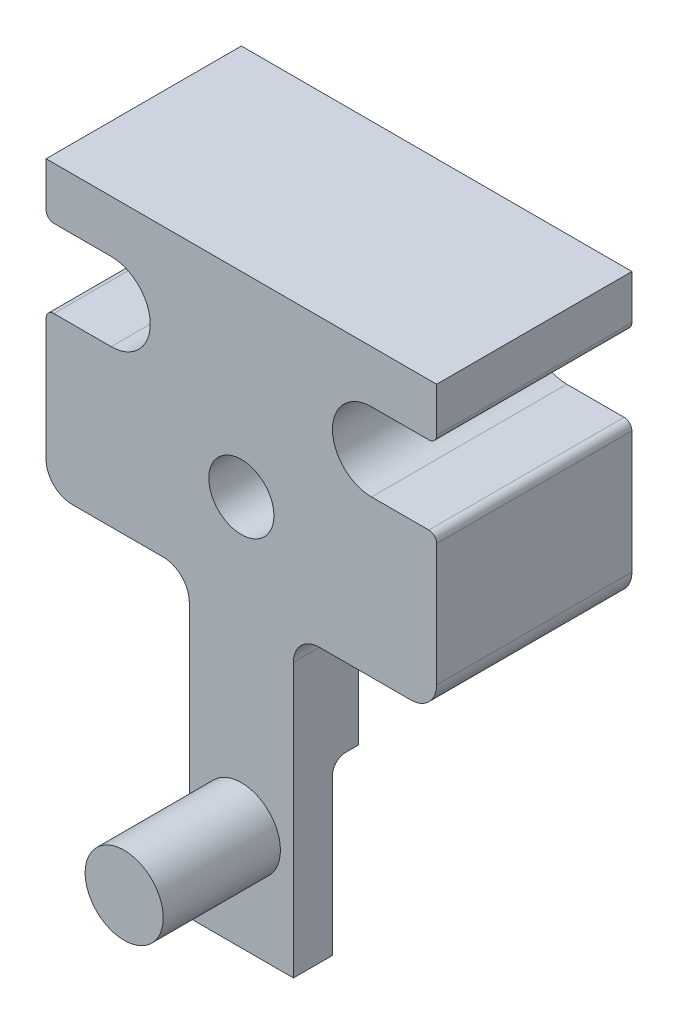
ISO-10303-21;
HEADER;
FILE_DESCRIPTION(('STEP AP214'),'2;1');
FILE_NAME('part.step','',(''),(''),'','','');
FILE_SCHEMA(('AUTOMOTIVE_DESIGN { 1 0 10303 214 1 1 1 1 }'));
ENDSEC;
DATA;
#1=APPLICATION_CONTEXT('core data for automotive mechanical design processes');
#2=APPLICATION_PROTOCOL_DEFINITION('international standard','automotive_design',2000,#1);
#3=PRODUCT_CONTEXT('',#1,'mechanical');
#4=PRODUCT('Part','Part','',(#3));
#5=PRODUCT_RELATED_PRODUCT_CATEGORY('part','',(#4));
#6=PRODUCT_DEFINITION_FORMATION('','',#4);
#7=PRODUCT_DEFINITION_CONTEXT('part definition',#1,'design');
#8=PRODUCT_DEFINITION('design','',#6,#7);
#9=PRODUCT_DEFINITION_SHAPE('','',#8);
#10=(LENGTH_UNIT() NAMED_UNIT(*) SI_UNIT(.MILLI.,.METRE.));
#11=(NAMED_UNIT(*) PLANE_ANGLE_UNIT() SI_UNIT($,.RADIAN.));
#12=(NAMED_UNIT(*) SI_UNIT($,.STERADIAN.) SOLID_ANGLE_UNIT());
#13=UNCERTAINTY_MEASURE_WITH_UNIT(LENGTH_MEASURE(1.E-05),#10,'distance_accuracy_value','');
#14=(GEOMETRIC_REPRESENTATION_CONTEXT(3) GLOBAL_UNCERTAINTY_ASSIGNED_CONTEXT((#13)) GLOBAL_UNIT_ASSIGNED_CONTEXT((#10,
#11,#12)) REPRESENTATION_CONTEXT('',''));
#15=CARTESIAN_POINT('',(0.,0.,0.));
#16=DIRECTION('',(0.,0.,1.));
#17=DIRECTION('',(1.,0.,0.));
#18=AXIS2_PLACEMENT_3D('',#15,#16,#17);
#19=CARTESIAN_POINT('',(0.,-5.5,7.5));
#20=DIRECTION('',(0.,1.,0.));
#21=DIRECTION('',(0.,0.,1.));
#22=AXIS2_PLACEMENT_3D('',#19,#20,#21);
#23=PLANE('',#22);
#24=DIRECTION('',(1.,0.,0.));
#25=VECTOR('',#24,1.);
#26=CARTESIAN_POINT('',(0.,-5.5,7.5));
#27=LINE('',#26,#25);
#28=CARTESIAN_POINT('',(3.,-5.5,7.5));
#29=VERTEX_POINT('',#28);
#30=CARTESIAN_POINT('',(6.50000000000001,-5.5,7.5));
#31=VERTEX_POINT('',#30);
#32=EDGE_CURVE('E355',#29,#31,#27,.T.);
#33=ORIENTED_EDGE('',*,*,#32,.F.);
#34=DIRECTION('',(0.,0.,1.));
#35=VECTOR('',#34,1.);
#36=CARTESIAN_POINT('',(3.,-5.5,7.5));
#37=LINE('',#36,#35);
#38=CARTESIAN_POINT('',(3.,-5.5,5.));
#39=VERTEX_POINT('',#38);
#40=EDGE_CURVE('E471',#29,#39,#37,.F.);
#41=ORIENTED_EDGE('',*,*,#40,.T.);
#42=DIRECTION('',(-1.,0.,0.));
#43=VECTOR('',#42,1.);
#44=CARTESIAN_POINT('',(-2.,-5.5,5.));
#45=LINE('',#44,#43);
#46=CARTESIAN_POINT('',(1.,-5.5,5.));
#47=VERTEX_POINT('',#46);
#48=EDGE_CURVE('E254',#39,#47,#45,.T.);
#49=ORIENTED_EDGE('',*,*,#48,.T.);
#50=DIRECTION('',(0.,0.,-1.));
#51=VECTOR('',#50,1.);
#52=CARTESIAN_POINT('',(1.,-5.5,3.5));
#53=LINE('',#52,#51);
#54=CARTESIAN_POINT('',(1.,-5.5,3.0857864376269));
#55=VERTEX_POINT('',#54);
#56=EDGE_CURVE('E278',#47,#55,#53,.T.);
#57=ORIENTED_EDGE('',*,*,#56,.T.);
#58=DIRECTION('',(-1.,0.,0.));
#59=VECTOR('',#58,1.);
#60=CARTESIAN_POINT('',(0.,-5.5,3.0857864376269));
#61=LINE('',#60,#59);
#62=CARTESIAN_POINT('',(-1.,-5.5,3.0857864376269));
#63=VERTEX_POINT('',#62);
#64=EDGE_CURVE('E261',#55,#63,#61,.T.);
#65=ORIENTED_EDGE('',*,*,#64,.T.);
#66=DIRECTION('',(0.,0.,-1.));
#67=VECTOR('',#66,1.);
#68=CARTESIAN_POINT('',(-1.,-5.5,3.5));
#69=LINE('',#68,#67);
#70=CARTESIAN_POINT('',(-1.,-5.5,5.));
#71=VERTEX_POINT('',#70);
#72=EDGE_CURVE('E258',#71,#63,#69,.T.);
#73=ORIENTED_EDGE('',*,*,#72,.F.);
#74=CARTESIAN_POINT('',(-3.,-5.5,5.));
#75=VERTEX_POINT('',#74);
#76=EDGE_CURVE('E245',#71,#75,#45,.T.);
#77=ORIENTED_EDGE('',*,*,#76,.T.);
#78=DIRECTION('',(0.,0.,1.));
#79=VECTOR('',#78,1.);
#80=CARTESIAN_POINT('',(-3.,-5.5,7.5));
#81=LINE('',#80,#79);
#82=CARTESIAN_POINT('',(-3.,-5.5,7.5));
#83=VERTEX_POINT('',#82);
#84=EDGE_CURVE('E469',#75,#83,#81,.T.);
#85=ORIENTED_EDGE('',*,*,#84,.T.);
#86=CARTESIAN_POINT('',(-6.49999999999999,-5.5,7.5));
#87=VERTEX_POINT('',#86);
#88=EDGE_CURVE('E352',#87,#83,#27,.T.);
#89=ORIENTED_EDGE('',*,*,#88,.F.);
#90=DIRECTION('',(0.,0.,-1.));
#91=VECTOR('',#90,1.);
#92=CARTESIAN_POINT('',(-6.49999999999999,-5.5,0.));
#93=LINE('',#92,#91);
#94=CARTESIAN_POINT('',(-6.49999999999999,-5.5,0.));
#95=VERTEX_POINT('',#94);
#96=EDGE_CURVE('E444',#87,#95,#93,.T.);
#97=ORIENTED_EDGE('',*,*,#96,.T.);
#98=DIRECTION('',(1.,0.,0.));
#99=VECTOR('',#98,1.);
#100=CARTESIAN_POINT('',(0.,-5.5,0.));
#101=LINE('',#100,#99);
#102=CARTESIAN_POINT('',(6.50000000000001,-5.5,0.));
#103=VERTEX_POINT('',#102);
#104=EDGE_CURVE('E379',#95,#103,#101,.T.);
#105=ORIENTED_EDGE('',*,*,#104,.T.);
#106=DIRECTION('',(0.,0.,-1.));
#107=VECTOR('',#106,1.);
#108=CARTESIAN_POINT('',(6.50000000000001,-5.5,7.5));
#109=LINE('',#108,#107);
#110=EDGE_CURVE('E447',#103,#31,#109,.F.);
#111=ORIENTED_EDGE('',*,*,#110,.T.);
#112=EDGE_LOOP('',(#33,#41,#49,#57,#65,#73,#77,#85,#89,#97,#105,#111));
#113=FACE_BOUND('',#112,.T.);
#114=ADVANCED_FACE('F39',(#113),#23,.F.);
#115=CARTESIAN_POINT('',(0.,0.,5.));
#116=DIRECTION('',(0.,0.,-1.));
#117=DIRECTION('',(-1.,0.,0.));
#118=AXIS2_PLACEMENT_3D('',#115,#116,#117);
#119=PLANE('',#118);
#120=DIRECTION('',(0.,1.,0.));
#121=VECTOR('',#120,1.);
#122=CARTESIAN_POINT('',(-1.,-5.5,5.));
#123=LINE('',#122,#121);
#124=CARTESIAN_POINT('',(-1.,-7.4142135623731,5.));
#125=VERTEX_POINT('',#124);
#126=EDGE_CURVE('E54',#125,#71,#123,.T.);
#127=ORIENTED_EDGE('',*,*,#126,.F.);
#128=DIRECTION('',(-1.,0.,0.));
#129=VECTOR('',#128,1.);
#130=CARTESIAN_POINT('',(1.,-7.4142135623731,5.));
#131=LINE('',#130,#129);
#132=CARTESIAN_POINT('',(1.,-7.4142135623731,5.));
#133=VERTEX_POINT('',#132);
#134=EDGE_CURVE('E481',#125,#133,#131,.F.);
#135=ORIENTED_EDGE('',*,*,#134,.T.);
#136=DIRECTION('',(0.,1.,0.));
#137=VECTOR('',#136,1.);
#138=CARTESIAN_POINT('',(1.,-5.5,5.));
#139=LINE('',#138,#137);
#140=EDGE_CURVE('E61',#133,#47,#139,.T.);
#141=ORIENTED_EDGE('',*,*,#140,.T.);
#142=ORIENTED_EDGE('',*,*,#48,.F.);
#143=CARTESIAN_POINT('',(3.,-6.5,5.));
#144=DIRECTION('',(0.,0.,-1.));
#145=DIRECTION('',(-1.,0.,0.));
#146=AXIS2_PLACEMENT_3D('',#143,#144,#145);
#147=CIRCLE('',#146,1.);
#148=CARTESIAN_POINT('',(2.,-6.5,5.));
#149=VERTEX_POINT('',#148);
#150=EDGE_CURVE('E485',#39,#149,#147,.F.);
#151=ORIENTED_EDGE('',*,*,#150,.T.);
#152=DIRECTION('',(0.,1.,0.));
#153=VECTOR('',#152,1.);
#154=CARTESIAN_POINT('',(2.,-5.5,5.));
#155=LINE('',#154,#153);
#156=CARTESIAN_POINT('',(2.,-10.5,5.));
#157=VERTEX_POINT('',#156);
#158=EDGE_CURVE('E307',#157,#149,#155,.T.);
#159=ORIENTED_EDGE('',*,*,#158,.F.);
#160=DIRECTION('',(1.,0.,0.));
#161=VECTOR('',#160,1.);
#162=CARTESIAN_POINT('',(-2.,-10.5,5.));
#163=LINE('',#162,#161);
#164=CARTESIAN_POINT('',(-2.,-10.5,5.));
#165=VERTEX_POINT('',#164);
#166=EDGE_CURVE('E304',#165,#157,#163,.T.);
#167=ORIENTED_EDGE('',*,*,#166,.F.);
#168=DIRECTION('',(0.,-1.,0.));
#169=VECTOR('',#168,1.);
#170=CARTESIAN_POINT('',(-2.,-5.5,5.));
#171=LINE('',#170,#169);
#172=CARTESIAN_POINT('',(-2.,-6.5,5.));
#173=VERTEX_POINT('',#172);
#174=EDGE_CURVE('E302',#173,#165,#171,.T.);
#175=ORIENTED_EDGE('',*,*,#174,.F.);
#176=CARTESIAN_POINT('',(-3.,-6.5,5.));
#177=DIRECTION('',(0.,0.,-1.));
#178=DIRECTION('',(-1.,0.,0.));
#179=AXIS2_PLACEMENT_3D('',#176,#177,#178);
#180=CIRCLE('',#179,1.);
#181=EDGE_CURVE('E250',#173,#75,#180,.F.);
#182=ORIENTED_EDGE('',*,*,#181,.T.);
#183=ORIENTED_EDGE('',*,*,#76,.F.);
#184=EDGE_LOOP('',(#127,#135,#141,#142,#151,#159,#167,#175,#182,#183));
#185=FACE_BOUND('',#184,.T.);
#186=ADVANCED_FACE('F247',(#185),#119,.T.);
#187=CARTESIAN_POINT('',(-2.,-10.5,5.));
#188=DIRECTION('',(0.,-1.,0.));
#189=DIRECTION('',(0.,0.,-1.));
#190=AXIS2_PLACEMENT_3D('',#187,#188,#189);
#191=PLANE('',#190);
#192=DIRECTION('',(0.,0.,1.));
#193=VECTOR('',#192,1.);
#194=CARTESIAN_POINT('',(2.,-10.5,5.));
#195=LINE('',#194,#193);
#196=CARTESIAN_POINT('',(2.,-10.5,5.5));
#197=VERTEX_POINT('',#196);
#198=EDGE_CURVE('E314',#157,#197,#195,.T.);
#199=ORIENTED_EDGE('',*,*,#198,.T.);
#200=DIRECTION('',(-1.,0.,0.));
#201=VECTOR('',#200,1.);
#202=CARTESIAN_POINT('',(-2.,-10.5,5.5));
#203=LINE('',#202,#201);
#204=CARTESIAN_POINT('',(-2.,-10.5,5.5));
#205=VERTEX_POINT('',#204);
#206=EDGE_CURVE('E456',#197,#205,#203,.T.);
#207=ORIENTED_EDGE('',*,*,#206,.T.);
#208=DIRECTION('',(0.,0.,1.));
#209=VECTOR('',#208,1.);
#210=CARTESIAN_POINT('',(-2.,-10.5,5.));
#211=LINE('',#210,#209);
#212=EDGE_CURVE('E310',#165,#205,#211,.T.);
#213=ORIENTED_EDGE('',*,*,#212,.F.);
#214=ORIENTED_EDGE('',*,*,#166,.T.);
#215=EDGE_LOOP('',(#199,#207,#213,#214));
#216=FACE_BOUND('',#215,.T.);
#217=ADVANCED_FACE('F519',(#216),#191,.T.);
#218=CARTESIAN_POINT('',(0.,0.5,7.5));
#219=DIRECTION('',(0.,1.,0.));
#220=DIRECTION('',(-1.,0.,0.));
#221=AXIS2_PLACEMENT_3D('',#218,#219,#220);
#222=PLANE('',#221);
#223=DIRECTION('',(1.,0.,0.));
#224=VECTOR('',#223,1.);
#225=CARTESIAN_POINT('',(0.,0.5,7.5));
#226=LINE('',#225,#224);
#227=CARTESIAN_POINT('',(4.99999999999999,0.499999999999998,7.5));
#228=VERTEX_POINT('',#227);
#229=CARTESIAN_POINT('',(7.20000000000001,0.499999999999998,7.5));
#230=VERTEX_POINT('',#229);
#231=EDGE_CURVE('E326',#228,#230,#226,.T.);
#232=ORIENTED_EDGE('',*,*,#231,.T.);
#233=DIRECTION('',(0.,0.,-1.));
#234=VECTOR('',#233,1.);
#235=CARTESIAN_POINT('',(7.20000000000001,0.499999999999998,0.));
#236=LINE('',#235,#234);
#237=CARTESIAN_POINT('',(7.20000000000001,0.499999999999998,0.));
#238=VERTEX_POINT('',#237);
#239=EDGE_CURVE('E398',#230,#238,#236,.T.);
#240=ORIENTED_EDGE('',*,*,#239,.T.);
#241=DIRECTION('',(1.,0.,0.));
#242=VECTOR('',#241,1.);
#243=CARTESIAN_POINT('',(0.,0.5,0.));
#244=LINE('',#243,#242);
#245=CARTESIAN_POINT('',(4.99999999999999,0.499999999999998,0.));
#246=VERTEX_POINT('',#245);
#247=EDGE_CURVE('E325',#246,#238,#244,.T.);
#248=ORIENTED_EDGE('',*,*,#247,.F.);
#249=DIRECTION('',(0.,0.,-1.));
#250=VECTOR('',#249,1.);
#251=CARTESIAN_POINT('',(4.99999999999999,0.499999999999998,7.5));
#252=LINE('',#251,#250);
#253=EDGE_CURVE('E396',#228,#246,#252,.T.);
#254=ORIENTED_EDGE('',*,*,#253,.F.);
#255=EDGE_LOOP('',(#232,#240,#248,#254));
#256=FACE_BOUND('',#255,.T.);
#257=ADVANCED_FACE('F606',(#256),#222,.T.);
#258=CARTESIAN_POINT('',(4.99999999999999,2.,7.5));
#259=DIRECTION('',(0.,0.,-1.));
#260=DIRECTION('',(-1.,0.,0.));
#261=AXIS2_PLACEMENT_3D('',#258,#259,#260);
#262=CYLINDRICAL_SURFACE('',#261,1.5);
#263=CARTESIAN_POINT('',(4.99999999999999,2.,0.));
#264=DIRECTION('',(0.,0.,1.));
#265=DIRECTION('',(1.,0.,0.));
#266=AXIS2_PLACEMENT_3D('',#263,#264,#265);
#267=CIRCLE('',#266,1.5);
#268=CARTESIAN_POINT('',(4.99999999999999,3.5,0.));
#269=VERTEX_POINT('',#268);
#270=EDGE_CURVE('E358',#246,#269,#267,.F.);
#271=ORIENTED_EDGE('',*,*,#270,.T.);
#272=DIRECTION('',(0.,0.,-1.));
#273=VECTOR('',#272,1.);
#274=CARTESIAN_POINT('',(4.99999999999999,3.5,7.5));
#275=LINE('',#274,#273);
#276=CARTESIAN_POINT('',(4.99999999999999,3.5,7.5));
#277=VERTEX_POINT('',#276);
#278=EDGE_CURVE('E393',#277,#269,#275,.T.);
#279=ORIENTED_EDGE('',*,*,#278,.F.);
#280=CARTESIAN_POINT('',(4.99999999999999,2.,7.5));
#281=DIRECTION('',(0.,0.,1.));
#282=DIRECTION('',(1.,0.,0.));
#283=AXIS2_PLACEMENT_3D('',#280,#281,#282);
#284=CIRCLE('',#283,1.5);
#285=EDGE_CURVE('E329',#228,#277,#284,.F.);
#286=ORIENTED_EDGE('',*,*,#285,.F.);
#287=ORIENTED_EDGE('',*,*,#253,.T.);
#288=EDGE_LOOP('',(#271,#279,#286,#287));
#289=FACE_BOUND('',#288,.T.);
#290=ADVANCED_FACE('F602',(#289),#262,.F.);
#291=CARTESIAN_POINT('',(0.,3.5,7.5));
#292=DIRECTION('',(0.,-1.,0.));
#293=DIRECTION('',(0.,0.,-1.));
#294=AXIS2_PLACEMENT_3D('',#291,#292,#293);
#295=PLANE('',#294);
#296=DIRECTION('',(-1.,0.,0.));
#297=VECTOR('',#296,1.);
#298=CARTESIAN_POINT('',(0.,3.5,0.));
#299=LINE('',#298,#297);
#300=CARTESIAN_POINT('',(7.20000000000001,3.5,0.));
#301=VERTEX_POINT('',#300);
#302=EDGE_CURVE('E361',#301,#269,#299,.T.);
#303=ORIENTED_EDGE('',*,*,#302,.F.);
#304=DIRECTION('',(0.,0.,-1.));
#305=VECTOR('',#304,1.);
#306=CARTESIAN_POINT('',(7.20000000000001,3.5,7.5));
#307=LINE('',#306,#305);
#308=CARTESIAN_POINT('',(7.20000000000001,3.5,7.5));
#309=VERTEX_POINT('',#308);
#310=EDGE_CURVE('E425',#301,#309,#307,.F.);
#311=ORIENTED_EDGE('',*,*,#310,.T.);
#312=DIRECTION('',(-1.,0.,0.));
#313=VECTOR('',#312,1.);
#314=CARTESIAN_POINT('',(0.,3.5,7.5));
#315=LINE('',#314,#313);
#316=EDGE_CURVE('E333',#309,#277,#315,.T.);
#317=ORIENTED_EDGE('',*,*,#316,.T.);
#318=ORIENTED_EDGE('',*,*,#278,.T.);
#319=EDGE_LOOP('',(#303,#311,#317,#318));
#320=FACE_BOUND('',#319,.T.);
#321=ADVANCED_FACE('F598',(#320),#295,.T.);
#322=CARTESIAN_POINT('',(7.50000000000001,0.,7.5));
#323=DIRECTION('',(-1.,0.,0.));
#324=DIRECTION('',(0.,0.,1.));
#325=AXIS2_PLACEMENT_3D('',#322,#323,#324);
#326=PLANE('',#325);
#327=DIRECTION('',(0.,1.,0.));
#328=VECTOR('',#327,1.);
#329=CARTESIAN_POINT('',(7.50000000000001,0.,7.5));
#330=LINE('',#329,#328);
#331=CARTESIAN_POINT('',(7.50000000000001,3.8,7.5));
#332=VERTEX_POINT('',#331);
#333=CARTESIAN_POINT('',(7.50000000000001,5.49999999999999,7.5));
#334=VERTEX_POINT('',#333);
#335=EDGE_CURVE('E335',#332,#334,#330,.T.);
#336=ORIENTED_EDGE('',*,*,#335,.F.);
#337=DIRECTION('',(0.,0.,-1.));
#338=VECTOR('',#337,1.);
#339=CARTESIAN_POINT('',(7.50000000000001,3.8,0.));
#340=LINE('',#339,#338);
#341=CARTESIAN_POINT('',(7.50000000000001,3.8,0.));
#342=VERTEX_POINT('',#341);
#343=EDGE_CURVE('E422',#332,#342,#340,.T.);
#344=ORIENTED_EDGE('',*,*,#343,.T.);
#345=DIRECTION('',(0.,1.,0.));
#346=VECTOR('',#345,1.);
#347=CARTESIAN_POINT('',(7.50000000000001,0.,0.));
#348=LINE('',#347,#346);
#349=CARTESIAN_POINT('',(7.50000000000001,5.49999999999999,0.));
#350=VERTEX_POINT('',#349);
#351=EDGE_CURVE('E363',#342,#350,#348,.T.);
#352=ORIENTED_EDGE('',*,*,#351,.T.);
#353=DIRECTION('',(0.,0.,-1.));
#354=VECTOR('',#353,1.);
#355=CARTESIAN_POINT('',(7.50000000000001,5.49999999999999,7.5));
#356=LINE('',#355,#354);
#357=EDGE_CURVE('E390',#334,#350,#356,.T.);
#358=ORIENTED_EDGE('',*,*,#357,.F.);
#359=EDGE_LOOP('',(#336,#344,#352,#358));
#360=FACE_BOUND('',#359,.T.);
#361=ADVANCED_FACE('F590',(#360),#326,.F.);
#362=CARTESIAN_POINT('',(0.,5.49999999999999,7.5));
#363=DIRECTION('',(0.,1.,0.));
#364=DIRECTION('',(0.,0.,1.));
#365=AXIS2_PLACEMENT_3D('',#362,#363,#364);
#366=PLANE('',#365);
#367=DIRECTION('',(1.,0.,0.));
#368=VECTOR('',#367,1.);
#369=CARTESIAN_POINT('',(0.,5.49999999999999,0.));
#370=LINE('',#369,#368);
#371=CARTESIAN_POINT('',(-7.49999999999999,5.49999999999999,0.));
#372=VERTEX_POINT('',#371);
#373=EDGE_CURVE('E365',#372,#350,#370,.T.);
#374=ORIENTED_EDGE('',*,*,#373,.F.);
#375=DIRECTION('',(0.,0.,-1.));
#376=VECTOR('',#375,1.);
#377=CARTESIAN_POINT('',(-7.49999999999999,5.49999999999999,7.5));
#378=LINE('',#377,#376);
#379=CARTESIAN_POINT('',(-7.49999999999999,5.49999999999999,7.5));
#380=VERTEX_POINT('',#379);
#381=EDGE_CURVE('E387',#380,#372,#378,.T.);
#382=ORIENTED_EDGE('',*,*,#381,.F.);
#383=DIRECTION('',(1.,0.,0.));
#384=VECTOR('',#383,1.);
#385=CARTESIAN_POINT('',(0.,5.49999999999999,7.5));
#386=LINE('',#385,#384);
#387=EDGE_CURVE('E337',#380,#334,#386,.T.);
#388=ORIENTED_EDGE('',*,*,#387,.T.);
#389=ORIENTED_EDGE('',*,*,#357,.T.);
#390=EDGE_LOOP('',(#374,#382,#388,#389));
#391=FACE_BOUND('',#390,.T.);
#392=ADVANCED_FACE('F586',(#391),#366,.T.);
#393=CARTESIAN_POINT('',(-7.49999999999999,0.,7.5));
#394=DIRECTION('',(-1.,0.,0.));
#395=DIRECTION('',(0.,0.,1.));
#396=AXIS2_PLACEMENT_3D('',#393,#394,#395);
#397=PLANE('',#396);
#398=DIRECTION('',(0.,1.,0.));
#399=VECTOR('',#398,1.);
#400=CARTESIAN_POINT('',(-7.49999999999999,0.,0.));
#401=LINE('',#400,#399);
#402=CARTESIAN_POINT('',(-7.49999999999999,3.8,0.));
#403=VERTEX_POINT('',#402);
#404=EDGE_CURVE('E368',#403,#372,#401,.T.);
#405=ORIENTED_EDGE('',*,*,#404,.F.);
#406=DIRECTION('',(0.,0.,-1.));
#407=VECTOR('',#406,1.);
#408=CARTESIAN_POINT('',(-7.49999999999999,3.8,7.5));
#409=LINE('',#408,#407);
#410=CARTESIAN_POINT('',(-7.49999999999999,3.8,7.5));
#411=VERTEX_POINT('',#410);
#412=EDGE_CURVE('E435',#403,#411,#409,.F.);
#413=ORIENTED_EDGE('',*,*,#412,.T.);
#414=DIRECTION('',(0.,1.,0.));
#415=VECTOR('',#414,1.);
#416=CARTESIAN_POINT('',(-7.49999999999999,0.,7.5));
#417=LINE('',#416,#415);
#418=EDGE_CURVE('E341',#411,#380,#417,.T.);
#419=ORIENTED_EDGE('',*,*,#418,.T.);
#420=ORIENTED_EDGE('',*,*,#381,.T.);
#421=EDGE_LOOP('',(#405,#413,#419,#420));
#422=FACE_BOUND('',#421,.T.);
#423=ADVANCED_FACE('F579',(#422),#397,.T.);
#424=CARTESIAN_POINT('',(0.,3.5,7.5));
#425=DIRECTION('',(0.,1.,0.));
#426=DIRECTION('',(0.,0.,1.));
#427=AXIS2_PLACEMENT_3D('',#424,#425,#426);
#428=PLANE('',#427);
#429=DIRECTION('',(1.,0.,0.));
#430=VECTOR('',#429,1.);
#431=CARTESIAN_POINT('',(0.,3.5,7.5));
#432=LINE('',#431,#430);
#433=CARTESIAN_POINT('',(-7.19999999999999,3.5,7.5));
#434=VERTEX_POINT('',#433);
#435=CARTESIAN_POINT('',(-4.99999999999999,3.5,7.5));
#436=VERTEX_POINT('',#435);
#437=EDGE_CURVE('E343',#434,#436,#432,.T.);
#438=ORIENTED_EDGE('',*,*,#437,.F.);
#439=DIRECTION('',(0.,0.,-1.));
#440=VECTOR('',#439,1.);
#441=CARTESIAN_POINT('',(-7.19999999999999,3.5,0.));
#442=LINE('',#441,#440);
#443=CARTESIAN_POINT('',(-7.19999999999999,3.5,0.));
#444=VERTEX_POINT('',#443);
#445=EDGE_CURVE('E432',#434,#444,#442,.T.);
#446=ORIENTED_EDGE('',*,*,#445,.T.);
#447=DIRECTION('',(1.,0.,0.));
#448=VECTOR('',#447,1.);
#449=CARTESIAN_POINT('',(0.,3.5,0.));
#450=LINE('',#449,#448);
#451=CARTESIAN_POINT('',(-4.99999999999999,3.5,0.));
#452=VERTEX_POINT('',#451);
#453=EDGE_CURVE('E370',#444,#452,#450,.T.);
#454=ORIENTED_EDGE('',*,*,#453,.T.);
#455=DIRECTION('',(0.,0.,-1.));
#456=VECTOR('',#455,1.);
#457=CARTESIAN_POINT('',(-4.99999999999999,3.5,7.5));
#458=LINE('',#457,#456);
#459=EDGE_CURVE('E384',#436,#452,#458,.T.);
#460=ORIENTED_EDGE('',*,*,#459,.F.);
#461=EDGE_LOOP('',(#438,#446,#454,#460));
#462=FACE_BOUND('',#461,.T.);
#463=ADVANCED_FACE('F571',(#462),#428,.F.);
#464=CARTESIAN_POINT('',(-4.99999999999999,2.,7.5));
#465=DIRECTION('',(0.,0.,-1.));
#466=DIRECTION('',(-1.,0.,0.));
#467=AXIS2_PLACEMENT_3D('',#464,#465,#466);
#468=CYLINDRICAL_SURFACE('',#467,1.5);
#469=CARTESIAN_POINT('',(-4.99999999999999,2.,0.));
#470=DIRECTION('',(0.,0.,1.));
#471=DIRECTION('',(1.,0.,0.));
#472=AXIS2_PLACEMENT_3D('',#469,#470,#471);
#473=CIRCLE('',#472,1.5);
#474=CARTESIAN_POINT('',(-4.99999999999999,0.499999999999998,0.));
#475=VERTEX_POINT('',#474);
#476=EDGE_CURVE('E373',#475,#452,#473,.T.);
#477=ORIENTED_EDGE('',*,*,#476,.F.);
#478=DIRECTION('',(0.,0.,-1.));
#479=VECTOR('',#478,1.);
#480=CARTESIAN_POINT('',(-4.99999999999999,0.499999999999998,7.5));
#481=LINE('',#480,#479);
#482=CARTESIAN_POINT('',(-4.99999999999999,0.499999999999998,7.5));
#483=VERTEX_POINT('',#482);
#484=EDGE_CURVE('E382',#483,#475,#481,.T.);
#485=ORIENTED_EDGE('',*,*,#484,.F.);
#486=CARTESIAN_POINT('',(-4.99999999999999,2.,7.5));
#487=DIRECTION('',(0.,0.,1.));
#488=DIRECTION('',(1.,0.,0.));
#489=AXIS2_PLACEMENT_3D('',#486,#487,#488);
#490=CIRCLE('',#489,1.5);
#491=EDGE_CURVE('E346',#483,#436,#490,.T.);
#492=ORIENTED_EDGE('',*,*,#491,.T.);
#493=ORIENTED_EDGE('',*,*,#459,.T.);
#494=EDGE_LOOP('',(#477,#485,#492,#493));
#495=FACE_BOUND('',#494,.T.);
#496=ADVANCED_FACE('F565',(#495),#468,.F.);
#497=CARTESIAN_POINT('',(0.,0.5,7.5));
#498=DIRECTION('',(0.,-1.,0.));
#499=DIRECTION('',(1.,0.,0.));
#500=AXIS2_PLACEMENT_3D('',#497,#498,#499);
#501=PLANE('',#500);
#502=DIRECTION('',(-1.,0.,0.));
#503=VECTOR('',#502,1.);
#504=CARTESIAN_POINT('',(0.,0.5,0.));
#505=LINE('',#504,#503);
#506=CARTESIAN_POINT('',(-7.19999999999999,0.499999999999998,0.));
#507=VERTEX_POINT('',#506);
#508=EDGE_CURVE('E376',#475,#507,#505,.T.);
#509=ORIENTED_EDGE('',*,*,#508,.T.);
#510=DIRECTION('',(0.,0.,-1.));
#511=VECTOR('',#510,1.);
#512=CARTESIAN_POINT('',(-7.19999999999999,0.499999999999998,7.5));
#513=LINE('',#512,#511);
#514=CARTESIAN_POINT('',(-7.19999999999999,0.499999999999998,7.5));
#515=VERTEX_POINT('',#514);
#516=EDGE_CURVE('E430',#507,#515,#513,.F.);
#517=ORIENTED_EDGE('',*,*,#516,.T.);
#518=DIRECTION('',(-1.,0.,0.));
#519=VECTOR('',#518,1.);
#520=CARTESIAN_POINT('',(0.,0.5,7.5));
#521=LINE('',#520,#519);
#522=EDGE_CURVE('E349',#483,#515,#521,.T.);
#523=ORIENTED_EDGE('',*,*,#522,.F.);
#524=ORIENTED_EDGE('',*,*,#484,.T.);
#525=EDGE_LOOP('',(#509,#517,#523,#524));
#526=FACE_BOUND('',#525,.T.);
#527=ADVANCED_FACE('F563',(#526),#501,.F.);
#528=CARTESIAN_POINT('',(-7.49999999999999,-4.5,0.));
#529=VERTEX_POINT('',#528);
#530=CARTESIAN_POINT('',(-7.49999999999999,0.199999999999998,0.));
#531=VERTEX_POINT('',#530);
#532=EDGE_CURVE('E371',#529,#531,#401,.T.);
#533=ORIENTED_EDGE('',*,*,#532,.F.);
#534=DIRECTION('',(0.,0.,-1.));
#535=VECTOR('',#534,1.);
#536=CARTESIAN_POINT('',(-7.49999999999999,-4.5,7.5));
#537=LINE('',#536,#535);
#538=CARTESIAN_POINT('',(-7.49999999999999,-4.5,7.5));
#539=VERTEX_POINT('',#538);
#540=EDGE_CURVE('E454',#529,#539,#537,.F.);
#541=ORIENTED_EDGE('',*,*,#540,.T.);
#542=CARTESIAN_POINT('',(-7.49999999999999,0.199999999999998,7.5));
#543=VERTEX_POINT('',#542);
#544=EDGE_CURVE('E344',#539,#543,#417,.T.);
#545=ORIENTED_EDGE('',*,*,#544,.T.);
#546=DIRECTION('',(0.,0.,-1.));
#547=VECTOR('',#546,1.);
#548=CARTESIAN_POINT('',(-7.49999999999999,0.199999999999998,0.));
#549=LINE('',#548,#547);
#550=EDGE_CURVE('E427',#543,#531,#549,.T.);
#551=ORIENTED_EDGE('',*,*,#550,.T.);
#552=EDGE_LOOP('',(#533,#541,#545,#551));
#553=FACE_BOUND('',#552,.T.);
#554=ADVANCED_FACE('F551',(#553),#397,.T.);
#555=CARTESIAN_POINT('',(7.50000000000001,-4.5,7.5));
#556=VERTEX_POINT('',#555);
#557=CARTESIAN_POINT('',(7.50000000000001,0.199999999999998,7.5));
#558=VERTEX_POINT('',#557);
#559=EDGE_CURVE('E338',#556,#558,#330,.T.);
#560=ORIENTED_EDGE('',*,*,#559,.F.);
#561=DIRECTION('',(0.,0.,-1.));
#562=VECTOR('',#561,1.);
#563=CARTESIAN_POINT('',(7.50000000000001,-4.5,7.5));
#564=LINE('',#563,#562);
#565=CARTESIAN_POINT('',(7.50000000000001,-4.5,0.));
#566=VERTEX_POINT('',#565);
#567=EDGE_CURVE('E437',#556,#566,#564,.T.);
#568=ORIENTED_EDGE('',*,*,#567,.T.);
#569=CARTESIAN_POINT('',(7.50000000000001,0.199999999999998,0.));
#570=VERTEX_POINT('',#569);
#571=EDGE_CURVE('E330',#566,#570,#348,.T.);
#572=ORIENTED_EDGE('',*,*,#571,.T.);
#573=DIRECTION('',(0.,0.,-1.));
#574=VECTOR('',#573,1.);
#575=CARTESIAN_POINT('',(7.50000000000001,0.199999999999998,7.5));
#576=LINE('',#575,#574);
#577=EDGE_CURVE('E410',#570,#558,#576,.F.);
#578=ORIENTED_EDGE('',*,*,#577,.T.);
#579=EDGE_LOOP('',(#560,#568,#572,#578));
#580=FACE_BOUND('',#579,.T.);
#581=ADVANCED_FACE('F546',(#580),#326,.F.);
#582=CARTESIAN_POINT('',(0.,0.,7.5));
#583=DIRECTION('',(0.,0.,1.));
#584=DIRECTION('',(1.,0.,0.));
#585=AXIS2_PLACEMENT_3D('',#582,#583,#584);
#586=PLANE('',#585);
#587=CARTESIAN_POINT('',(0.,-13.,7.5));
#588=DIRECTION('',(0.,0.,1.));
#589=DIRECTION('',(1.,0.,0.));
#590=AXIS2_PLACEMENT_3D('',#587,#588,#589);
#591=CIRCLE('',#590,1.5);
#592=CARTESIAN_POINT('',(1.5,-13.,7.5));
#593=VERTEX_POINT('',#592);
#594=EDGE_CURVE('E272',#593,#593,#591,.T.);
#595=ORIENTED_EDGE('',*,*,#594,.F.);
#596=EDGE_LOOP('',(#595));
#597=FACE_BOUND('',#596,.T.);
#598=CARTESIAN_POINT('',(0.,-2.,7.5));
#599=DIRECTION('',(0.,0.,1.));
#600=DIRECTION('',(1.,0.,0.));
#601=AXIS2_PLACEMENT_3D('',#598,#599,#600);
#602=CIRCLE('',#601,1.24999999999999);
#603=CARTESIAN_POINT('',(1.24999999999999,-2.,7.5));
#604=VERTEX_POINT('',#603);
#605=EDGE_CURVE('E317',#604,#604,#602,.T.);
#606=ORIENTED_EDGE('',*,*,#605,.F.);
#607=EDGE_LOOP('',(#606));
#608=FACE_BOUND('',#607,.T.);
#609=ORIENTED_EDGE('',*,*,#88,.T.);
#610=CARTESIAN_POINT('',(-3.,-6.5,7.5));
#611=DIRECTION('',(0.,0.,1.));
#612=DIRECTION('',(1.,0.,0.));
#613=AXIS2_PLACEMENT_3D('',#610,#611,#612);
#614=CIRCLE('',#613,1.);
#615=CARTESIAN_POINT('',(-2.,-6.5,7.5));
#616=VERTEX_POINT('',#615);
#617=EDGE_CURVE('E487',#83,#616,#614,.F.);
#618=ORIENTED_EDGE('',*,*,#617,.T.);
#619=DIRECTION('',(0.,-1.,0.));
#620=VECTOR('',#619,1.);
#621=CARTESIAN_POINT('',(-2.,-5.5,7.5));
#622=LINE('',#621,#620);
#623=CARTESIAN_POINT('',(-2.,-17.,7.5));
#624=VERTEX_POINT('',#623);
#625=EDGE_CURVE('E298',#616,#624,#622,.T.);
#626=ORIENTED_EDGE('',*,*,#625,.T.);
#627=DIRECTION('',(1.,0.,0.));
#628=VECTOR('',#627,1.);
#629=CARTESIAN_POINT('',(-2.,-17.,7.5));
#630=LINE('',#629,#628);
#631=CARTESIAN_POINT('',(2.,-17.,7.5));
#632=VERTEX_POINT('',#631);
#633=EDGE_CURVE('E283',#624,#632,#630,.T.);
#634=ORIENTED_EDGE('',*,*,#633,.T.);
#635=DIRECTION('',(0.,1.,0.));
#636=VECTOR('',#635,1.);
#637=CARTESIAN_POINT('',(2.,-5.5,7.5));
#638=LINE('',#637,#636);
#639=CARTESIAN_POINT('',(2.,-6.5,7.5));
#640=VERTEX_POINT('',#639);
#641=EDGE_CURVE('E255',#632,#640,#638,.T.);
#642=ORIENTED_EDGE('',*,*,#641,.T.);
#643=CARTESIAN_POINT('',(3.,-6.5,7.5));
#644=DIRECTION('',(0.,0.,1.));
#645=DIRECTION('',(1.,0.,0.));
#646=AXIS2_PLACEMENT_3D('',#643,#644,#645);
#647=CIRCLE('',#646,1.);
#648=EDGE_CURVE('E483',#640,#29,#647,.F.);
#649=ORIENTED_EDGE('',*,*,#648,.T.);
#650=ORIENTED_EDGE('',*,*,#32,.T.);
#651=CARTESIAN_POINT('',(6.50000000000001,-4.5,7.5));
#652=DIRECTION('',(0.,0.,1.));
#653=DIRECTION('',(1.,0.,0.));
#654=AXIS2_PLACEMENT_3D('',#651,#652,#653);
#655=CIRCLE('',#654,1.);
#656=EDGE_CURVE('E452',#31,#556,#655,.T.);
#657=ORIENTED_EDGE('',*,*,#656,.T.);
#658=ORIENTED_EDGE('',*,*,#559,.T.);
#659=CARTESIAN_POINT('',(7.20000000000001,0.199999999999998,7.5));
#660=DIRECTION('',(0.,0.,1.));
#661=DIRECTION('',(1.,0.,0.));
#662=AXIS2_PLACEMENT_3D('',#659,#660,#661);
#663=CIRCLE('',#662,0.3);
#664=EDGE_CURVE('E420',#558,#230,#663,.T.);
#665=ORIENTED_EDGE('',*,*,#664,.T.);
#666=ORIENTED_EDGE('',*,*,#231,.F.);
#667=ORIENTED_EDGE('',*,*,#285,.T.);
#668=ORIENTED_EDGE('',*,*,#316,.F.);
#669=CARTESIAN_POINT('',(7.20000000000001,3.8,7.5));
#670=DIRECTION('',(0.,0.,1.));
#671=DIRECTION('',(1.,0.,0.));
#672=AXIS2_PLACEMENT_3D('',#669,#670,#671);
#673=CIRCLE('',#672,0.3);
#674=EDGE_CURVE('E418',#309,#332,#673,.T.);
#675=ORIENTED_EDGE('',*,*,#674,.T.);
#676=ORIENTED_EDGE('',*,*,#335,.T.);
#677=ORIENTED_EDGE('',*,*,#387,.F.);
#678=ORIENTED_EDGE('',*,*,#418,.F.);
#679=CARTESIAN_POINT('',(-7.19999999999999,3.8,7.5));
#680=DIRECTION('',(0.,0.,1.));
#681=DIRECTION('',(1.,0.,0.));
#682=AXIS2_PLACEMENT_3D('',#679,#680,#681);
#683=CIRCLE('',#682,0.3);
#684=EDGE_CURVE('E413',#411,#434,#683,.T.);
#685=ORIENTED_EDGE('',*,*,#684,.T.);
#686=ORIENTED_EDGE('',*,*,#437,.T.);
#687=ORIENTED_EDGE('',*,*,#491,.F.);
#688=ORIENTED_EDGE('',*,*,#522,.T.);
#689=CARTESIAN_POINT('',(-7.19999999999999,0.199999999999998,7.5));
#690=DIRECTION('',(0.,0.,1.));
#691=DIRECTION('',(1.,0.,0.));
#692=AXIS2_PLACEMENT_3D('',#689,#690,#691);
#693=CIRCLE('',#692,0.3);
#694=EDGE_CURVE('E415',#515,#543,#693,.T.);
#695=ORIENTED_EDGE('',*,*,#694,.T.);
#696=ORIENTED_EDGE('',*,*,#544,.F.);
#697=CARTESIAN_POINT('',(-6.49999999999999,-4.5,7.5));
#698=DIRECTION('',(0.,0.,1.));
#699=DIRECTION('',(1.,0.,0.));
#700=AXIS2_PLACEMENT_3D('',#697,#698,#699);
#701=CIRCLE('',#700,1.);
#702=EDGE_CURVE('E450',#539,#87,#701,.T.);
#703=ORIENTED_EDGE('',*,*,#702,.T.);
#704=EDGE_LOOP('',(#609,#618,#626,#634,#642,#649,#650,#657,#658,#665,#666,#667,#668,#675,#676,
#677,#678,#685,#686,#687,#688,#695,#696,#703));
#705=FACE_BOUND('',#704,.T.);
#706=ADVANCED_FACE('F527',(#597,#608,#705),#586,.T.);
#707=CARTESIAN_POINT('',(0.,0.,0.));
#708=DIRECTION('',(0.,0.,1.));
#709=DIRECTION('',(1.,0.,0.));
#710=AXIS2_PLACEMENT_3D('',#707,#708,#709);
#711=PLANE('',#710);
#712=CARTESIAN_POINT('',(0.,-2.,0.));
#713=DIRECTION('',(0.,0.,1.));
#714=DIRECTION('',(1.,0.,0.));
#715=AXIS2_PLACEMENT_3D('',#712,#713,#714);
#716=CIRCLE('',#715,1.24999999999999);
#717=CARTESIAN_POINT('',(1.24999999999999,-2.,0.));
#718=VERTEX_POINT('',#717);
#719=EDGE_CURVE('E322',#718,#718,#716,.T.);
#720=ORIENTED_EDGE('',*,*,#719,.T.);
#721=EDGE_LOOP('',(#720));
#722=FACE_BOUND('',#721,.T.);
#723=ORIENTED_EDGE('',*,*,#571,.F.);
#724=CARTESIAN_POINT('',(6.50000000000001,-4.5,0.));
#725=DIRECTION('',(0.,0.,1.));
#726=DIRECTION('',(1.,0.,0.));
#727=AXIS2_PLACEMENT_3D('',#724,#725,#726);
#728=CIRCLE('',#727,1.);
#729=EDGE_CURVE('E442',#566,#103,#728,.F.);
#730=ORIENTED_EDGE('',*,*,#729,.T.);
#731=ORIENTED_EDGE('',*,*,#104,.F.);
#732=CARTESIAN_POINT('',(-6.49999999999999,-4.5,0.));
#733=DIRECTION('',(0.,0.,1.));
#734=DIRECTION('',(1.,0.,0.));
#735=AXIS2_PLACEMENT_3D('',#732,#733,#734);
#736=CIRCLE('',#735,1.);
#737=EDGE_CURVE('E440',#95,#529,#736,.F.);
#738=ORIENTED_EDGE('',*,*,#737,.T.);
#739=ORIENTED_EDGE('',*,*,#532,.T.);
#740=CARTESIAN_POINT('',(-7.19999999999999,0.199999999999998,0.));
#741=DIRECTION('',(0.,0.,1.));
#742=DIRECTION('',(1.,0.,0.));
#743=AXIS2_PLACEMENT_3D('',#740,#741,#742);
#744=CIRCLE('',#743,0.3);
#745=EDGE_CURVE('E403',#531,#507,#744,.F.);
#746=ORIENTED_EDGE('',*,*,#745,.T.);
#747=ORIENTED_EDGE('',*,*,#508,.F.);
#748=ORIENTED_EDGE('',*,*,#476,.T.);
#749=ORIENTED_EDGE('',*,*,#453,.F.);
#750=CARTESIAN_POINT('',(-7.19999999999999,3.8,0.));
#751=DIRECTION('',(0.,0.,1.));
#752=DIRECTION('',(1.,0.,0.));
#753=AXIS2_PLACEMENT_3D('',#750,#751,#752);
#754=CIRCLE('',#753,0.3);
#755=EDGE_CURVE('E401',#444,#403,#754,.F.);
#756=ORIENTED_EDGE('',*,*,#755,.T.);
#757=ORIENTED_EDGE('',*,*,#404,.T.);
#758=ORIENTED_EDGE('',*,*,#373,.T.);
#759=ORIENTED_EDGE('',*,*,#351,.F.);
#760=CARTESIAN_POINT('',(7.20000000000001,3.8,0.));
#761=DIRECTION('',(0.,0.,1.));
#762=DIRECTION('',(1.,0.,0.));
#763=AXIS2_PLACEMENT_3D('',#760,#761,#762);
#764=CIRCLE('',#763,0.3);
#765=EDGE_CURVE('E405',#342,#301,#764,.F.);
#766=ORIENTED_EDGE('',*,*,#765,.T.);
#767=ORIENTED_EDGE('',*,*,#302,.T.);
#768=ORIENTED_EDGE('',*,*,#270,.F.);
#769=ORIENTED_EDGE('',*,*,#247,.T.);
#770=CARTESIAN_POINT('',(7.20000000000001,0.199999999999998,0.));
#771=DIRECTION('',(0.,0.,1.));
#772=DIRECTION('',(1.,0.,0.));
#773=AXIS2_PLACEMENT_3D('',#770,#771,#772);
#774=CIRCLE('',#773,0.3);
#775=EDGE_CURVE('E407',#238,#570,#774,.F.);
#776=ORIENTED_EDGE('',*,*,#775,.T.);
#777=EDGE_LOOP('',(#723,#730,#731,#738,#739,#746,#747,#748,#749,#756,#757,#758,#759,#766,#767,
#768,#769,#776));
#778=FACE_BOUND('',#777,.T.);
#779=ADVANCED_FACE('F538',(#722,#778),#711,.F.);
#780=CARTESIAN_POINT('',(7.20000000000001,0.199999999999998,7.5));
#781=DIRECTION('',(0.,0.,1.));
#782=DIRECTION('',(1.,0.,0.));
#783=AXIS2_PLACEMENT_3D('',#780,#781,#782);
#784=CYLINDRICAL_SURFACE('',#783,0.3);
#785=ORIENTED_EDGE('',*,*,#664,.F.);
#786=ORIENTED_EDGE('',*,*,#577,.F.);
#787=ORIENTED_EDGE('',*,*,#775,.F.);
#788=ORIENTED_EDGE('',*,*,#239,.F.);
#789=EDGE_LOOP('',(#785,#786,#787,#788));
#790=FACE_BOUND('',#789,.T.);
#791=ADVANCED_FACE('F609',(#790),#784,.T.);
#792=CARTESIAN_POINT('',(7.20000000000001,3.8,7.5));
#793=DIRECTION('',(0.,0.,1.));
#794=DIRECTION('',(1.,0.,0.));
#795=AXIS2_PLACEMENT_3D('',#792,#793,#794);
#796=CYLINDRICAL_SURFACE('',#795,0.3);
#797=ORIENTED_EDGE('',*,*,#674,.F.);
#798=ORIENTED_EDGE('',*,*,#310,.F.);
#799=ORIENTED_EDGE('',*,*,#765,.F.);
#800=ORIENTED_EDGE('',*,*,#343,.F.);
#801=EDGE_LOOP('',(#797,#798,#799,#800));
#802=FACE_BOUND('',#801,.T.);
#803=ADVANCED_FACE('F594',(#802),#796,.T.);
#804=CARTESIAN_POINT('',(-7.19999999999999,0.199999999999998,7.5));
#805=DIRECTION('',(0.,0.,1.));
#806=DIRECTION('',(1.,0.,0.));
#807=AXIS2_PLACEMENT_3D('',#804,#805,#806);
#808=CYLINDRICAL_SURFACE('',#807,0.3);
#809=ORIENTED_EDGE('',*,*,#694,.F.);
#810=ORIENTED_EDGE('',*,*,#516,.F.);
#811=ORIENTED_EDGE('',*,*,#745,.F.);
#812=ORIENTED_EDGE('',*,*,#550,.F.);
#813=EDGE_LOOP('',(#809,#810,#811,#812));
#814=FACE_BOUND('',#813,.T.);
#815=ADVANCED_FACE('F559',(#814),#808,.T.);
#816=CARTESIAN_POINT('',(-7.19999999999999,3.8,7.5));
#817=DIRECTION('',(0.,0.,1.));
#818=DIRECTION('',(1.,0.,0.));
#819=AXIS2_PLACEMENT_3D('',#816,#817,#818);
#820=CYLINDRICAL_SURFACE('',#819,0.3);
#821=ORIENTED_EDGE('',*,*,#684,.F.);
#822=ORIENTED_EDGE('',*,*,#412,.F.);
#823=ORIENTED_EDGE('',*,*,#755,.F.);
#824=ORIENTED_EDGE('',*,*,#445,.F.);
#825=EDGE_LOOP('',(#821,#822,#823,#824));
#826=FACE_BOUND('',#825,.T.);
#827=ADVANCED_FACE('F575',(#826),#820,.T.);
#828=CARTESIAN_POINT('',(6.50000000000001,-4.5,7.5));
#829=DIRECTION('',(0.,0.,-1.));
#830=DIRECTION('',(-1.,0.,0.));
#831=AXIS2_PLACEMENT_3D('',#828,#829,#830);
#832=CYLINDRICAL_SURFACE('',#831,1.);
#833=ORIENTED_EDGE('',*,*,#656,.F.);
#834=ORIENTED_EDGE('',*,*,#110,.F.);
#835=ORIENTED_EDGE('',*,*,#729,.F.);
#836=ORIENTED_EDGE('',*,*,#567,.F.);
#837=EDGE_LOOP('',(#833,#834,#835,#836));
#838=FACE_BOUND('',#837,.T.);
#839=ADVANCED_FACE('F543',(#838),#832,.T.);
#840=CARTESIAN_POINT('',(-6.49999999999999,-4.5,7.5));
#841=DIRECTION('',(0.,0.,1.));
#842=DIRECTION('',(1.,0.,0.));
#843=AXIS2_PLACEMENT_3D('',#840,#841,#842);
#844=CYLINDRICAL_SURFACE('',#843,1.);
#845=ORIENTED_EDGE('',*,*,#702,.F.);
#846=ORIENTED_EDGE('',*,*,#540,.F.);
#847=ORIENTED_EDGE('',*,*,#737,.F.);
#848=ORIENTED_EDGE('',*,*,#96,.F.);
#849=EDGE_LOOP('',(#845,#846,#847,#848));
#850=FACE_BOUND('',#849,.T.);
#851=ADVANCED_FACE('F533',(#850),#844,.T.);
#852=CARTESIAN_POINT('',(0.,-2.,7.5));
#853=DIRECTION('',(0.,0.,1.));
#854=DIRECTION('',(1.,0.,0.));
#855=AXIS2_PLACEMENT_3D('',#852,#853,#854);
#856=CYLINDRICAL_SURFACE('',#855,1.24999999999999);
#857=ORIENTED_EDGE('',*,*,#719,.F.);
#858=EDGE_LOOP('',(#857));
#859=FACE_BOUND('',#858,.T.);
#860=ORIENTED_EDGE('',*,*,#605,.T.);
#861=EDGE_LOOP('',(#860));
#862=FACE_BOUND('',#861,.T.);
#863=ADVANCED_FACE('F654',(#859,#862),#856,.F.);
#864=CARTESIAN_POINT('',(2.,-5.5,5.));
#865=DIRECTION('',(1.,0.,0.));
#866=DIRECTION('',(0.,1.,0.));
#867=AXIS2_PLACEMENT_3D('',#864,#865,#866);
#868=PLANE('',#867);
#869=ORIENTED_EDGE('',*,*,#158,.T.);
#870=DIRECTION('',(0.,0.,1.));
#871=VECTOR('',#870,1.);
#872=CARTESIAN_POINT('',(2.,-6.5,5.));
#873=LINE('',#872,#871);
#874=EDGE_CURVE('E465',#149,#640,#873,.T.);
#875=ORIENTED_EDGE('',*,*,#874,.T.);
#876=ORIENTED_EDGE('',*,*,#641,.F.);
#877=DIRECTION('',(0.,0.,1.));
#878=VECTOR('',#877,1.);
#879=CARTESIAN_POINT('',(2.,-17.,6.));
#880=LINE('',#879,#878);
#881=CARTESIAN_POINT('',(2.,-17.,6.));
#882=VERTEX_POINT('',#881);
#883=EDGE_CURVE('E295',#882,#632,#880,.T.);
#884=ORIENTED_EDGE('',*,*,#883,.F.);
#885=DIRECTION('',(0.,1.,0.));
#886=VECTOR('',#885,1.);
#887=CARTESIAN_POINT('',(2.,-10.5,6.));
#888=LINE('',#887,#886);
#889=CARTESIAN_POINT('',(2.,-11.,6.));
#890=VERTEX_POINT('',#889);
#891=EDGE_CURVE('E284',#882,#890,#888,.T.);
#892=ORIENTED_EDGE('',*,*,#891,.T.);
#893=CARTESIAN_POINT('',(2.,-11.,5.5));
#894=DIRECTION('',(1.,0.,0.));
#895=DIRECTION('',(0.,1.,0.));
#896=AXIS2_PLACEMENT_3D('',#893,#894,#895);
#897=CIRCLE('',#896,0.5);
#898=EDGE_CURVE('E463',#890,#197,#897,.F.);
#899=ORIENTED_EDGE('',*,*,#898,.T.);
#900=ORIENTED_EDGE('',*,*,#198,.F.);
#901=EDGE_LOOP('',(#869,#875,#876,#884,#892,#899,#900));
#902=FACE_BOUND('',#901,.T.);
#903=ADVANCED_FACE('F514',(#902),#868,.T.);
#904=CARTESIAN_POINT('',(-2.,-5.5,5.));
#905=DIRECTION('',(-1.,0.,0.));
#906=DIRECTION('',(0.,-1.,0.));
#907=AXIS2_PLACEMENT_3D('',#904,#905,#906);
#908=PLANE('',#907);
#909=ORIENTED_EDGE('',*,*,#625,.F.);
#910=DIRECTION('',(0.,0.,1.));
#911=VECTOR('',#910,1.);
#912=CARTESIAN_POINT('',(-2.,-6.5,5.));
#913=LINE('',#912,#911);
#914=EDGE_CURVE('E474',#616,#173,#913,.F.);
#915=ORIENTED_EDGE('',*,*,#914,.T.);
#916=ORIENTED_EDGE('',*,*,#174,.T.);
#917=ORIENTED_EDGE('',*,*,#212,.T.);
#918=CARTESIAN_POINT('',(-2.,-11.,5.5));
#919=DIRECTION('',(-1.,0.,0.));
#920=DIRECTION('',(0.,-1.,0.));
#921=AXIS2_PLACEMENT_3D('',#918,#919,#920);
#922=CIRCLE('',#921,0.5);
#923=CARTESIAN_POINT('',(-2.,-11.,6.));
#924=VERTEX_POINT('',#923);
#925=EDGE_CURVE('E461',#205,#924,#922,.F.);
#926=ORIENTED_EDGE('',*,*,#925,.T.);
#927=DIRECTION('',(0.,-1.,0.));
#928=VECTOR('',#927,1.);
#929=CARTESIAN_POINT('',(-2.,-10.5,6.));
#930=LINE('',#929,#928);
#931=CARTESIAN_POINT('',(-2.,-17.,6.));
#932=VERTEX_POINT('',#931);
#933=EDGE_CURVE('E287',#924,#932,#930,.T.);
#934=ORIENTED_EDGE('',*,*,#933,.T.);
#935=DIRECTION('',(0.,0.,1.));
#936=VECTOR('',#935,1.);
#937=CARTESIAN_POINT('',(-2.,-17.,6.));
#938=LINE('',#937,#936);
#939=EDGE_CURVE('E292',#932,#624,#938,.T.);
#940=ORIENTED_EDGE('',*,*,#939,.T.);
#941=EDGE_LOOP('',(#909,#915,#916,#917,#926,#934,#940));
#942=FACE_BOUND('',#941,.T.);
#943=ADVANCED_FACE('F650',(#942),#908,.T.);
#944=CARTESIAN_POINT('',(-2.,-17.,6.));
#945=DIRECTION('',(0.,-1.,0.));
#946=DIRECTION('',(0.,0.,-1.));
#947=AXIS2_PLACEMENT_3D('',#944,#945,#946);
#948=PLANE('',#947);
#949=ORIENTED_EDGE('',*,*,#633,.F.);
#950=ORIENTED_EDGE('',*,*,#939,.F.);
#951=DIRECTION('',(1.,0.,0.));
#952=VECTOR('',#951,1.);
#953=CARTESIAN_POINT('',(-2.,-17.,6.));
#954=LINE('',#953,#952);
#955=EDGE_CURVE('E289',#932,#882,#954,.T.);
#956=ORIENTED_EDGE('',*,*,#955,.T.);
#957=ORIENTED_EDGE('',*,*,#883,.T.);
#958=EDGE_LOOP('',(#949,#950,#956,#957));
#959=FACE_BOUND('',#958,.T.);
#960=ADVANCED_FACE('F653',(#959),#948,.T.);
#961=CARTESIAN_POINT('',(0.,0.,6.));
#962=DIRECTION('',(0.,0.,1.));
#963=DIRECTION('',(1.,0.,0.));
#964=AXIS2_PLACEMENT_3D('',#961,#962,#963);
#965=PLANE('',#964);
#966=ORIENTED_EDGE('',*,*,#933,.F.);
#967=DIRECTION('',(-1.,0.,0.));
#968=VECTOR('',#967,1.);
#969=CARTESIAN_POINT('',(0.,-11.,6.));
#970=LINE('',#969,#968);
#971=EDGE_CURVE('E459',#924,#890,#970,.F.);
#972=ORIENTED_EDGE('',*,*,#971,.T.);
#973=ORIENTED_EDGE('',*,*,#891,.F.);
#974=ORIENTED_EDGE('',*,*,#955,.F.);
#975=EDGE_LOOP('',(#966,#972,#973,#974));
#976=FACE_BOUND('',#975,.T.);
#977=ADVANCED_FACE('F689',(#976),#965,.F.);
#978=CARTESIAN_POINT('',(-2.,-11.,5.5));
#979=DIRECTION('',(-1.,0.,0.));
#980=DIRECTION('',(0.,0.,1.));
#981=AXIS2_PLACEMENT_3D('',#978,#979,#980);
#982=CYLINDRICAL_SURFACE('',#981,0.5);
#983=ORIENTED_EDGE('',*,*,#898,.F.);
#984=ORIENTED_EDGE('',*,*,#971,.F.);
#985=ORIENTED_EDGE('',*,*,#925,.F.);
#986=ORIENTED_EDGE('',*,*,#206,.F.);
#987=EDGE_LOOP('',(#983,#984,#985,#986));
#988=FACE_BOUND('',#987,.T.);
#989=ADVANCED_FACE('F688',(#988),#982,.F.);
#990=CARTESIAN_POINT('',(1.,-7.,5.));
#991=DIRECTION('',(0.,-0.707106781186548,-0.707106781186547));
#992=DIRECTION('',(0.,0.707106781186547,-0.707106781186548));
#993=AXIS2_PLACEMENT_3D('',#990,#991,#992);
#994=PLANE('',#993);
#995=DIRECTION('',(0.,-0.707106781186547,0.707106781186548));
#996=VECTOR('',#995,1.);
#997=CARTESIAN_POINT('',(-1.,-7.,5.));
#998=LINE('',#997,#996);
#999=CARTESIAN_POINT('',(-1.,-5.79289321881345,3.79289321881345));
#1000=VERTEX_POINT('',#999);
#1001=CARTESIAN_POINT('',(-1.,-6.70710678118655,4.70710678118655));
#1002=VERTEX_POINT('',#1001);
#1003=EDGE_CURVE('E264',#1000,#1002,#998,.T.);
#1004=ORIENTED_EDGE('',*,*,#1003,.F.);
#1005=DIRECTION('',(-1.,0.,0.));
#1006=VECTOR('',#1005,1.);
#1007=CARTESIAN_POINT('',(1.,-5.79289321881345,3.79289321881345));
#1008=LINE('',#1007,#1006);
#1009=CARTESIAN_POINT('',(1.,-5.79289321881345,3.79289321881345));
#1010=VERTEX_POINT('',#1009);
#1011=EDGE_CURVE('E479',#1000,#1010,#1008,.F.);
#1012=ORIENTED_EDGE('',*,*,#1011,.T.);
#1013=DIRECTION('',(0.,-0.707106781186547,0.707106781186548));
#1014=VECTOR('',#1013,1.);
#1015=CARTESIAN_POINT('',(1.,-7.,5.));
#1016=LINE('',#1015,#1014);
#1017=CARTESIAN_POINT('',(1.,-6.70710678118655,4.70710678118655));
#1018=VERTEX_POINT('',#1017);
#1019=EDGE_CURVE('E280',#1010,#1018,#1016,.T.);
#1020=ORIENTED_EDGE('',*,*,#1019,.T.);
#1021=DIRECTION('',(-1.,0.,0.));
#1022=VECTOR('',#1021,1.);
#1023=CARTESIAN_POINT('',(-1.,-6.70710678118655,4.70710678118655));
#1024=LINE('',#1023,#1022);
#1025=EDGE_CURVE('E476',#1018,#1002,#1024,.T.);
#1026=ORIENTED_EDGE('',*,*,#1025,.T.);
#1027=EDGE_LOOP('',(#1004,#1012,#1020,#1026));
#1028=FACE_BOUND('',#1027,.T.);
#1029=ADVANCED_FACE('F502',(#1028),#994,.T.);
#1030=CARTESIAN_POINT('',(1.,0.,0.));
#1031=DIRECTION('',(-1.,0.,0.));
#1032=DIRECTION('',(0.,0.,1.));
#1033=AXIS2_PLACEMENT_3D('',#1030,#1031,#1032);
#1034=PLANE('',#1033);
#1035=ORIENTED_EDGE('',*,*,#140,.F.);
#1036=CARTESIAN_POINT('',(1.,-7.4142135623731,4.));
#1037=DIRECTION('',(-1.,0.,0.));
#1038=DIRECTION('',(0.,0.,1.));
#1039=AXIS2_PLACEMENT_3D('',#1036,#1037,#1038);
#1040=CIRCLE('',#1039,1.);
#1041=EDGE_CURVE('E11',#133,#1018,#1040,.T.);
#1042=ORIENTED_EDGE('',*,*,#1041,.T.);
#1043=ORIENTED_EDGE('',*,*,#1019,.F.);
#1044=CARTESIAN_POINT('',(1.,-6.5,3.0857864376269));
#1045=DIRECTION('',(-1.,0.,0.));
#1046=DIRECTION('',(0.,0.,1.));
#1047=AXIS2_PLACEMENT_3D('',#1044,#1045,#1046);
#1048=CIRCLE('',#1047,1.);
#1049=EDGE_CURVE('E492',#1010,#55,#1048,.T.);
#1050=ORIENTED_EDGE('',*,*,#1049,.T.);
#1051=ORIENTED_EDGE('',*,*,#56,.F.);
#1052=EDGE_LOOP('',(#1035,#1042,#1043,#1050,#1051));
#1053=FACE_BOUND('',#1052,.T.);
#1054=ADVANCED_FACE('F496',(#1053),#1034,.F.);
#1055=CARTESIAN_POINT('',(-1.,0.,0.));
#1056=DIRECTION('',(-1.,0.,0.));
#1057=DIRECTION('',(0.,0.,1.));
#1058=AXIS2_PLACEMENT_3D('',#1055,#1056,#1057);
#1059=PLANE('',#1058);
#1060=ORIENTED_EDGE('',*,*,#126,.T.);
#1061=ORIENTED_EDGE('',*,*,#72,.T.);
#1062=CARTESIAN_POINT('',(-1.,-6.5,3.0857864376269));
#1063=DIRECTION('',(-1.,0.,0.));
#1064=DIRECTION('',(0.,0.,1.));
#1065=AXIS2_PLACEMENT_3D('',#1062,#1063,#1064);
#1066=CIRCLE('',#1065,1.);
#1067=EDGE_CURVE('E490',#63,#1000,#1066,.F.);
#1068=ORIENTED_EDGE('',*,*,#1067,.T.);
#1069=ORIENTED_EDGE('',*,*,#1003,.T.);
#1070=CARTESIAN_POINT('',(-1.,-7.4142135623731,4.));
#1071=DIRECTION('',(-1.,0.,0.));
#1072=DIRECTION('',(0.,0.,1.));
#1073=AXIS2_PLACEMENT_3D('',#1070,#1071,#1072);
#1074=CIRCLE('',#1073,1.);
#1075=EDGE_CURVE('E47',#1002,#125,#1074,.F.);
#1076=ORIENTED_EDGE('',*,*,#1075,.T.);
#1077=EDGE_LOOP('',(#1060,#1061,#1068,#1069,#1076));
#1078=FACE_BOUND('',#1077,.T.);
#1079=ADVANCED_FACE('F266',(#1078),#1059,.T.);
#1080=CARTESIAN_POINT('',(3.,-6.5,5.));
#1081=DIRECTION('',(0.,0.,1.));
#1082=DIRECTION('',(1.,0.,0.));
#1083=AXIS2_PLACEMENT_3D('',#1080,#1081,#1082);
#1084=CYLINDRICAL_SURFACE('',#1083,1.);
#1085=ORIENTED_EDGE('',*,*,#150,.F.);
#1086=ORIENTED_EDGE('',*,*,#40,.F.);
#1087=ORIENTED_EDGE('',*,*,#648,.F.);
#1088=ORIENTED_EDGE('',*,*,#874,.F.);
#1089=EDGE_LOOP('',(#1085,#1086,#1087,#1088));
#1090=FACE_BOUND('',#1089,.T.);
#1091=ADVANCED_FACE('F510',(#1090),#1084,.F.);
#1092=CARTESIAN_POINT('',(-3.,-6.5,7.5));
#1093=DIRECTION('',(0.,0.,1.));
#1094=DIRECTION('',(1.,0.,0.));
#1095=AXIS2_PLACEMENT_3D('',#1092,#1093,#1094);
#1096=CYLINDRICAL_SURFACE('',#1095,1.);
#1097=ORIENTED_EDGE('',*,*,#181,.F.);
#1098=ORIENTED_EDGE('',*,*,#914,.F.);
#1099=ORIENTED_EDGE('',*,*,#617,.F.);
#1100=ORIENTED_EDGE('',*,*,#84,.F.);
#1101=EDGE_LOOP('',(#1097,#1098,#1099,#1100));
#1102=FACE_BOUND('',#1101,.T.);
#1103=ADVANCED_FACE('F523',(#1102),#1096,.F.);
#1104=CARTESIAN_POINT('',(0.,-6.5,3.0857864376269));
#1105=DIRECTION('',(-1.,0.,0.));
#1106=DIRECTION('',(0.,0.,1.));
#1107=AXIS2_PLACEMENT_3D('',#1104,#1105,#1106);
#1108=CYLINDRICAL_SURFACE('',#1107,1.);
#1109=ORIENTED_EDGE('',*,*,#1049,.F.);
#1110=ORIENTED_EDGE('',*,*,#1011,.F.);
#1111=ORIENTED_EDGE('',*,*,#1067,.F.);
#1112=ORIENTED_EDGE('',*,*,#64,.F.);
#1113=EDGE_LOOP('',(#1109,#1110,#1111,#1112));
#1114=FACE_BOUND('',#1113,.T.);
#1115=ADVANCED_FACE('F499',(#1114),#1108,.F.);
#1116=CARTESIAN_POINT('',(1.,-7.4142135623731,4.));
#1117=DIRECTION('',(1.,0.,0.));
#1118=DIRECTION('',(0.,0.,-1.));
#1119=AXIS2_PLACEMENT_3D('',#1116,#1117,#1118);
#1120=CYLINDRICAL_SURFACE('',#1119,1.);
#1121=ORIENTED_EDGE('',*,*,#1041,.F.);
#1122=ORIENTED_EDGE('',*,*,#134,.F.);
#1123=ORIENTED_EDGE('',*,*,#1075,.F.);
#1124=ORIENTED_EDGE('',*,*,#1025,.F.);
#1125=EDGE_LOOP('',(#1121,#1122,#1123,#1124));
#1126=FACE_BOUND('',#1125,.T.);
#1127=ADVANCED_FACE('F41',(#1126),#1120,.F.);
#1128=CARTESIAN_POINT('',(0.,-13.,12.));
#1129=DIRECTION('',(0.,0.,-1.));
#1130=DIRECTION('',(-1.,0.,0.));
#1131=AXIS2_PLACEMENT_3D('',#1128,#1129,#1130);
#1132=CYLINDRICAL_SURFACE('',#1131,1.5);
#1133=CARTESIAN_POINT('',(0.,-13.,12.));
#1134=DIRECTION('',(0.,0.,1.));
#1135=DIRECTION('',(1.,0.,0.));
#1136=AXIS2_PLACEMENT_3D('',#1133,#1134,#1135);
#1137=CIRCLE('',#1136,1.5);
#1138=CARTESIAN_POINT('',(1.5,-13.,12.));
#1139=VERTEX_POINT('',#1138);
#1140=EDGE_CURVE('E269',#1139,#1139,#1137,.T.);
#1141=ORIENTED_EDGE('',*,*,#1140,.F.);
#1142=EDGE_LOOP('',(#1141));
#1143=FACE_BOUND('',#1142,.T.);
#1144=ORIENTED_EDGE('',*,*,#594,.T.);
#1145=EDGE_LOOP('',(#1144));
#1146=FACE_BOUND('',#1145,.T.);
#1147=ADVANCED_FACE('F669',(#1143,#1146),#1132,.T.);
#1148=CARTESIAN_POINT('',(0.,-13.,12.));
#1149=DIRECTION('',(0.,0.,1.));
#1150=DIRECTION('',(1.,0.,0.));
#1151=AXIS2_PLACEMENT_3D('',#1148,#1149,#1150);
#1152=PLANE('',#1151);
#1153=ORIENTED_EDGE('',*,*,#1140,.T.);
#1154=EDGE_LOOP('',(#1153));
#1155=FACE_BOUND('',#1154,.T.);
#1156=ADVANCED_FACE('F671',(#1155),#1152,.T.);
#1157=CLOSED_SHELL('',(#114,#186,#217,#257,#290,#321,#361,#392,#423,#463,#496,#527,#554,#581,
#706,#779,#791,#803,#815,#827,#839,#851,#863,#903,#943,#960,#977,#989,#1029,#1054,#1079,#1091,
#1103,#1115,#1127,#1147,#1156));
#1158=MANIFOLD_SOLID_BREP('B2',#1157);
#1159=ADVANCED_BREP_SHAPE_REPRESENTATION('',(#18,#1158),#14);
#1160=SHAPE_DEFINITION_REPRESENTATION(#9,#1159);
ENDSEC;
END-ISO-10303-21;
